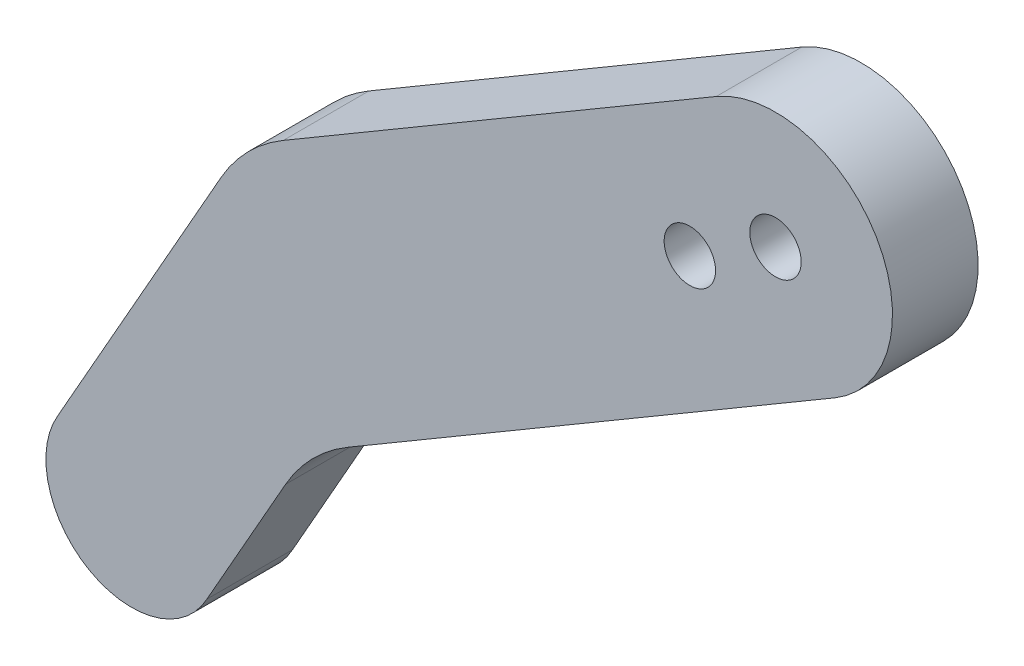
ISO-10303-21;
HEADER;
FILE_DESCRIPTION(('STEP AP214'),'2;1');
FILE_NAME('part.step','',(''),(''),'','','');
FILE_SCHEMA(('AUTOMOTIVE_DESIGN { 1 0 10303 214 1 1 1 1 }'));
ENDSEC;
DATA;
#1=APPLICATION_CONTEXT('core data for automotive mechanical design processes');
#2=APPLICATION_PROTOCOL_DEFINITION('international standard','automotive_design',2000,#1);
#3=PRODUCT_CONTEXT('',#1,'mechanical');
#4=PRODUCT('Part','Part','',(#3));
#5=PRODUCT_RELATED_PRODUCT_CATEGORY('part','',(#4));
#6=PRODUCT_DEFINITION_FORMATION('','',#4);
#7=PRODUCT_DEFINITION_CONTEXT('part definition',#1,'design');
#8=PRODUCT_DEFINITION('design','',#6,#7);
#9=PRODUCT_DEFINITION_SHAPE('','',#8);
#10=(LENGTH_UNIT() NAMED_UNIT(*) SI_UNIT(.MILLI.,.METRE.));
#11=(NAMED_UNIT(*) PLANE_ANGLE_UNIT() SI_UNIT($,.RADIAN.));
#12=(NAMED_UNIT(*) SI_UNIT($,.STERADIAN.) SOLID_ANGLE_UNIT());
#13=UNCERTAINTY_MEASURE_WITH_UNIT(LENGTH_MEASURE(1.E-05),#10,'distance_accuracy_value','');
#14=(GEOMETRIC_REPRESENTATION_CONTEXT(3) GLOBAL_UNCERTAINTY_ASSIGNED_CONTEXT((#13)) GLOBAL_UNIT_ASSIGNED_CONTEXT((#10,
#11,#12)) REPRESENTATION_CONTEXT('',''));
#15=CARTESIAN_POINT('',(0.,0.,0.));
#16=DIRECTION('',(0.,0.,1.));
#17=DIRECTION('',(1.,0.,0.));
#18=AXIS2_PLACEMENT_3D('',#15,#16,#17);
#19=CARTESIAN_POINT('',(8.69918007203384,-4.93196371380908,5.));
#20=DIRECTION('',(-0.869918007203384,0.493196371380907,0.));
#21=DIRECTION('',(-0.493196371380907,-0.869918007203384,0.));
#22=AXIS2_PLACEMENT_3D('',#19,#20,#21);
#23=PLANE('',#22);
#24=DIRECTION('',(0.493196371380907,0.869918007203384,0.));
#25=VECTOR('',#24,1.);
#26=CARTESIAN_POINT('',(8.69918007203384,-4.93196371380908,0.));
#27=LINE('',#26,#25);
#28=CARTESIAN_POINT('',(8.69918007203384,-4.93196371380907,0.));
#29=VERTEX_POINT('',#28);
#30=CARTESIAN_POINT('',(13.29602083439,3.17611409751714,0.));
#31=VERTEX_POINT('',#30);
#32=EDGE_CURVE('E134',#29,#31,#27,.T.);
#33=ORIENTED_EDGE('',*,*,#32,.T.);
#34=DIRECTION('',(0.,0.,-1.));
#35=VECTOR('',#34,1.);
#36=CARTESIAN_POINT('',(13.29602083439,3.17611409751714,5.));
#37=LINE('',#36,#35);
#38=CARTESIAN_POINT('',(13.29602083439,3.17611409751714,5.));
#39=VERTEX_POINT('',#38);
#40=EDGE_CURVE('E11',#39,#31,#37,.T.);
#41=ORIENTED_EDGE('',*,*,#40,.F.);
#42=DIRECTION('',(0.493196371380907,0.869918007203384,0.));
#43=VECTOR('',#42,1.);
#44=CARTESIAN_POINT('',(8.69918007203384,-4.93196371380908,5.));
#45=LINE('',#44,#43);
#46=CARTESIAN_POINT('',(8.69918007203384,-4.93196371380907,5.));
#47=VERTEX_POINT('',#46);
#48=EDGE_CURVE('E153',#47,#39,#45,.T.);
#49=ORIENTED_EDGE('',*,*,#48,.F.);
#50=DIRECTION('',(0.,0.,-1.));
#51=VECTOR('',#50,1.);
#52=CARTESIAN_POINT('',(8.69918007203384,-4.93196371380907,5.));
#53=LINE('',#52,#51);
#54=EDGE_CURVE('E130',#47,#29,#53,.T.);
#55=ORIENTED_EDGE('',*,*,#54,.T.);
#56=EDGE_LOOP('',(#33,#41,#49,#55));
#57=FACE_BOUND('',#56,.T.);
#58=ADVANCED_FACE('F37',(#57),#23,.F.);
#59=CARTESIAN_POINT('',(21.9952009064238,-1.75584961629192,5.));
#60=DIRECTION('',(0.,0.,-1.));
#61=DIRECTION('',(-1.,0.,0.));
#62=AXIS2_PLACEMENT_3D('',#59,#60,#61);
#63=CYLINDRICAL_SURFACE('',#62,10.);
#64=CARTESIAN_POINT('',(21.9952009064238,-1.75584961629192,0.));
#65=DIRECTION('',(0.,0.,1.));
#66=DIRECTION('',(1.,0.,0.));
#67=AXIS2_PLACEMENT_3D('',#64,#65,#66);
#68=CIRCLE('',#67,10.);
#69=CARTESIAN_POINT('',(16.9274718288517,6.8649462864267,0.));
#70=VERTEX_POINT('',#69);
#71=EDGE_CURVE('E137',#31,#70,#68,.F.);
#72=ORIENTED_EDGE('',*,*,#71,.T.);
#73=DIRECTION('',(0.,0.,-1.));
#74=VECTOR('',#73,1.);
#75=CARTESIAN_POINT('',(16.9274718288517,6.8649462864267,5.));
#76=LINE('',#75,#74);
#77=CARTESIAN_POINT('',(16.9274718288517,6.8649462864267,5.));
#78=VERTEX_POINT('',#77);
#79=EDGE_CURVE('E46',#78,#70,#76,.T.);
#80=ORIENTED_EDGE('',*,*,#79,.F.);
#81=CARTESIAN_POINT('',(21.9952009064238,-1.75584961629192,5.));
#82=DIRECTION('',(0.,0.,1.));
#83=DIRECTION('',(1.,0.,0.));
#84=AXIS2_PLACEMENT_3D('',#81,#82,#83);
#85=CIRCLE('',#84,10.);
#86=EDGE_CURVE('E94',#39,#78,#85,.F.);
#87=ORIENTED_EDGE('',*,*,#86,.F.);
#88=ORIENTED_EDGE('',*,*,#40,.T.);
#89=EDGE_LOOP('',(#72,#80,#87,#88));
#90=FACE_BOUND('',#89,.T.);
#91=ADVANCED_FACE('F203',(#90),#63,.F.);
#92=CARTESIAN_POINT('',(1.34814467413126,-2.29335071096395,5.));
#93=DIRECTION('',(-0.50677290775721,0.862079590271862,0.));
#94=DIRECTION('',(-0.862079590271862,-0.50677290775721,0.));
#95=AXIS2_PLACEMENT_3D('',#92,#93,#94);
#96=PLANE('',#95);
#97=DIRECTION('',(0.862079590271862,0.506772907757211,0.));
#98=VECTOR('',#97,1.);
#99=CARTESIAN_POINT('',(1.34814467413126,-2.29335071096395,0.));
#100=LINE('',#99,#98);
#101=CARTESIAN_POINT('',(45.3595137185401,23.5787030027507,0.));
#102=VERTEX_POINT('',#101);
#103=EDGE_CURVE('E140',#70,#102,#100,.T.);
#104=ORIENTED_EDGE('',*,*,#103,.T.);
#105=DIRECTION('',(0.,0.,-1.));
#106=VECTOR('',#105,1.);
#107=CARTESIAN_POINT('',(45.3595137185401,23.5787030027507,5.));
#108=LINE('',#107,#106);
#109=CARTESIAN_POINT('',(45.3595137185401,23.5787030027507,5.));
#110=VERTEX_POINT('',#109);
#111=EDGE_CURVE('E159',#110,#102,#108,.T.);
#112=ORIENTED_EDGE('',*,*,#111,.F.);
#113=DIRECTION('',(0.862079590271862,0.506772907757211,0.));
#114=VECTOR('',#113,1.);
#115=CARTESIAN_POINT('',(1.34814467413126,-2.29335071096395,5.));
#116=LINE('',#115,#114);
#117=EDGE_CURVE('E176',#78,#110,#116,.T.);
#118=ORIENTED_EDGE('',*,*,#117,.F.);
#119=ORIENTED_EDGE('',*,*,#79,.T.);
#120=EDGE_LOOP('',(#104,#112,#118,#119));
#121=FACE_BOUND('',#120,.T.);
#122=ADVANCED_FACE('F207',(#121),#96,.F.);
#123=CARTESIAN_POINT('',(41.8981903888098,29.466816104728,5.));
#124=DIRECTION('',(0.,0.,-1.));
#125=DIRECTION('',(-1.,0.,0.));
#126=AXIS2_PLACEMENT_3D('',#123,#124,#125);
#127=CYLINDRICAL_SURFACE('',#126,6.83012701892219);
#128=CARTESIAN_POINT('',(41.8981903888098,29.466816104728,0.));
#129=DIRECTION('',(0.,0.,1.));
#130=DIRECTION('',(1.,0.,0.));
#131=AXIS2_PLACEMENT_3D('',#128,#129,#130);
#132=CIRCLE('',#131,6.83012701892219);
#133=CARTESIAN_POINT('',(38.4368670590796,35.3549292067052,0.));
#134=VERTEX_POINT('',#133);
#135=EDGE_CURVE('E143',#134,#102,#132,.F.);
#136=ORIENTED_EDGE('',*,*,#135,.F.);
#137=DIRECTION('',(0.,0.,-1.));
#138=VECTOR('',#137,1.);
#139=CARTESIAN_POINT('',(38.4368670590796,35.3549292067052,5.));
#140=LINE('',#139,#138);
#141=CARTESIAN_POINT('',(38.4368670590796,35.3549292067052,5.));
#142=VERTEX_POINT('',#141);
#143=EDGE_CURVE('E157',#142,#134,#140,.T.);
#144=ORIENTED_EDGE('',*,*,#143,.F.);
#145=CARTESIAN_POINT('',(41.8981903888098,29.466816104728,5.));
#146=DIRECTION('',(0.,0.,1.));
#147=DIRECTION('',(1.,0.,0.));
#148=AXIS2_PLACEMENT_3D('',#145,#146,#147);
#149=CIRCLE('',#148,6.83012701892219);
#150=EDGE_CURVE('E178',#142,#110,#149,.F.);
#151=ORIENTED_EDGE('',*,*,#150,.T.);
#152=ORIENTED_EDGE('',*,*,#111,.T.);
#153=EDGE_LOOP('',(#136,#144,#151,#152));
#154=FACE_BOUND('',#153,.T.);
#155=ADVANCED_FACE('F211',(#154),#127,.T.);
#156=CARTESIAN_POINT('',(-5.57450198532932,9.4828754929905,5.));
#157=DIRECTION('',(-0.50677290775721,0.862079590271863,0.));
#158=DIRECTION('',(-0.862079590271862,-0.50677290775721,0.));
#159=AXIS2_PLACEMENT_3D('',#156,#157,#158);
#160=PLANE('',#159);
#161=DIRECTION('',(0.862079590271863,0.50677290775721,0.));
#162=VECTOR('',#161,1.);
#163=CARTESIAN_POINT('',(-5.57450198532932,9.4828754929905,0.));
#164=LINE('',#163,#162);
#165=CARTESIAN_POINT('',(13.1602554706269,20.4960900722696,0.));
#166=VERTEX_POINT('',#165);
#167=EDGE_CURVE('E146',#166,#134,#164,.T.);
#168=ORIENTED_EDGE('',*,*,#167,.F.);
#169=DIRECTION('',(0.,0.,-1.));
#170=VECTOR('',#169,1.);
#171=CARTESIAN_POINT('',(13.1602554706269,20.4960900722696,5.));
#172=LINE('',#171,#170);
#173=CARTESIAN_POINT('',(13.1602554706269,20.4960900722696,5.));
#174=VERTEX_POINT('',#173);
#175=EDGE_CURVE('E119',#174,#166,#172,.T.);
#176=ORIENTED_EDGE('',*,*,#175,.F.);
#177=DIRECTION('',(0.862079590271863,0.50677290775721,0.));
#178=VECTOR('',#177,1.);
#179=CARTESIAN_POINT('',(-5.57450198532932,9.4828754929905,5.));
#180=LINE('',#179,#178);
#181=EDGE_CURVE('E126',#174,#142,#180,.T.);
#182=ORIENTED_EDGE('',*,*,#181,.T.);
#183=ORIENTED_EDGE('',*,*,#143,.T.);
#184=EDGE_LOOP('',(#168,#176,#182,#183));
#185=FACE_BOUND('',#184,.T.);
#186=ADVANCED_FACE('F182',(#185),#160,.T.);
#187=CARTESIAN_POINT('',(18.227984548199,11.875294169551,5.));
#188=DIRECTION('',(0.,0.,-1.));
#189=DIRECTION('',(-1.,0.,0.));
#190=AXIS2_PLACEMENT_3D('',#187,#188,#189);
#191=CYLINDRICAL_SURFACE('',#190,10.);
#192=CARTESIAN_POINT('',(18.227984548199,11.875294169551,0.));
#193=DIRECTION('',(0.,0.,1.));
#194=DIRECTION('',(1.,0.,0.));
#195=AXIS2_PLACEMENT_3D('',#192,#193,#194);
#196=CIRCLE('',#195,10.);
#197=CARTESIAN_POINT('',(9.52880447616521,16.80725788336,0.));
#198=VERTEX_POINT('',#197);
#199=EDGE_CURVE('E114',#198,#166,#196,.F.);
#200=ORIENTED_EDGE('',*,*,#199,.F.);
#201=DIRECTION('',(0.,0.,-1.));
#202=VECTOR('',#201,1.);
#203=CARTESIAN_POINT('',(9.52880447616521,16.80725788336,5.));
#204=LINE('',#203,#202);
#205=CARTESIAN_POINT('',(9.52880447616521,16.80725788336,5.));
#206=VERTEX_POINT('',#205);
#207=EDGE_CURVE('E109',#206,#198,#204,.T.);
#208=ORIENTED_EDGE('',*,*,#207,.F.);
#209=CARTESIAN_POINT('',(18.227984548199,11.875294169551,5.));
#210=DIRECTION('',(0.,0.,1.));
#211=DIRECTION('',(1.,0.,0.));
#212=AXIS2_PLACEMENT_3D('',#209,#210,#211);
#213=CIRCLE('',#212,10.);
#214=EDGE_CURVE('E112',#206,#174,#213,.F.);
#215=ORIENTED_EDGE('',*,*,#214,.T.);
#216=ORIENTED_EDGE('',*,*,#175,.T.);
#217=EDGE_LOOP('',(#200,#208,#215,#216));
#218=FACE_BOUND('',#217,.T.);
#219=ADVANCED_FACE('F111',(#218),#191,.T.);
#220=CARTESIAN_POINT('',(0.,0.,5.));
#221=DIRECTION('',(-0.869918007203384,0.493196371380907,0.));
#222=DIRECTION('',(-0.493196371380907,-0.869918007203384,0.));
#223=AXIS2_PLACEMENT_3D('',#220,#221,#222);
#224=PLANE('',#223);
#225=DIRECTION('',(0.493196371380907,0.869918007203384,0.));
#226=VECTOR('',#225,1.);
#227=CARTESIAN_POINT('',(0.,0.,0.));
#228=LINE('',#227,#226);
#229=CARTESIAN_POINT('',(0.,0.,0.));
#230=VERTEX_POINT('',#229);
#231=EDGE_CURVE('E150',#230,#198,#228,.T.);
#232=ORIENTED_EDGE('',*,*,#231,.F.);
#233=DIRECTION('',(0.,0.,-1.));
#234=VECTOR('',#233,1.);
#235=CARTESIAN_POINT('',(0.,0.,5.));
#236=LINE('',#235,#234);
#237=CARTESIAN_POINT('',(0.,0.,5.));
#238=VERTEX_POINT('',#237);
#239=EDGE_CURVE('E83',#238,#230,#236,.T.);
#240=ORIENTED_EDGE('',*,*,#239,.F.);
#241=DIRECTION('',(0.493196371380907,0.869918007203384,0.));
#242=VECTOR('',#241,1.);
#243=CARTESIAN_POINT('',(0.,0.,5.));
#244=LINE('',#243,#242);
#245=EDGE_CURVE('E123',#238,#206,#244,.T.);
#246=ORIENTED_EDGE('',*,*,#245,.T.);
#247=ORIENTED_EDGE('',*,*,#207,.T.);
#248=EDGE_LOOP('',(#232,#240,#246,#247));
#249=FACE_BOUND('',#248,.T.);
#250=ADVANCED_FACE('F128',(#249),#224,.T.);
#251=CARTESIAN_POINT('',(4.30532765313558,-2.54405348545767,5.));
#252=DIRECTION('',(0.,0.,-1.));
#253=DIRECTION('',(-1.,0.,0.));
#254=AXIS2_PLACEMENT_3D('',#251,#252,#253);
#255=CYLINDRICAL_SURFACE('',#254,5.00080536891042);
#256=CARTESIAN_POINT('',(4.30532765313558,-2.54405348545767,0.));
#257=DIRECTION('',(0.,0.,1.));
#258=DIRECTION('',(1.,0.,0.));
#259=AXIS2_PLACEMENT_3D('',#256,#257,#258);
#260=CIRCLE('',#259,5.00080536891042);
#261=EDGE_CURVE('E86',#230,#29,#260,.T.);
#262=ORIENTED_EDGE('',*,*,#261,.T.);
#263=ORIENTED_EDGE('',*,*,#54,.F.);
#264=CARTESIAN_POINT('',(4.30532765313558,-2.54405348545767,5.));
#265=DIRECTION('',(0.,0.,1.));
#266=DIRECTION('',(1.,0.,0.));
#267=AXIS2_PLACEMENT_3D('',#264,#265,#266);
#268=CIRCLE('',#267,5.00080536891042);
#269=EDGE_CURVE('E55',#238,#47,#268,.T.);
#270=ORIENTED_EDGE('',*,*,#269,.F.);
#271=ORIENTED_EDGE('',*,*,#239,.T.);
#272=EDGE_LOOP('',(#262,#263,#270,#271));
#273=FACE_BOUND('',#272,.T.);
#274=ADVANCED_FACE('F191',(#273),#255,.T.);
#275=CARTESIAN_POINT('',(0.,0.,5.));
#276=DIRECTION('',(0.,0.,1.));
#277=DIRECTION('',(1.,0.,0.));
#278=AXIS2_PLACEMENT_3D('',#275,#276,#277);
#279=PLANE('',#278);
#280=CARTESIAN_POINT('',(36.8981903888099,26.5275694651144,5.));
#281=DIRECTION('',(0.,0.,1.));
#282=DIRECTION('',(1.,0.,0.));
#283=AXIS2_PLACEMENT_3D('',#280,#281,#282);
#284=CIRCLE('',#283,1.5);
#285=CARTESIAN_POINT('',(38.3981903888099,26.5275694651144,5.));
#286=VERTEX_POINT('',#285);
#287=EDGE_CURVE('E171',#286,#286,#284,.T.);
#288=ORIENTED_EDGE('',*,*,#287,.F.);
#289=EDGE_LOOP('',(#288));
#290=FACE_BOUND('',#289,.T.);
#291=CARTESIAN_POINT('',(41.8981903888098,29.466816104728,5.));
#292=DIRECTION('',(0.,0.,1.));
#293=DIRECTION('',(1.,0.,0.));
#294=AXIS2_PLACEMENT_3D('',#291,#292,#293);
#295=CIRCLE('',#294,1.5);
#296=CARTESIAN_POINT('',(43.3981903888099,29.466816104728,5.));
#297=VERTEX_POINT('',#296);
#298=EDGE_CURVE('E163',#297,#297,#295,.T.);
#299=ORIENTED_EDGE('',*,*,#298,.F.);
#300=EDGE_LOOP('',(#299));
#301=FACE_BOUND('',#300,.T.);
#302=ORIENTED_EDGE('',*,*,#48,.T.);
#303=ORIENTED_EDGE('',*,*,#86,.T.);
#304=ORIENTED_EDGE('',*,*,#117,.T.);
#305=ORIENTED_EDGE('',*,*,#150,.F.);
#306=ORIENTED_EDGE('',*,*,#181,.F.);
#307=ORIENTED_EDGE('',*,*,#214,.F.);
#308=ORIENTED_EDGE('',*,*,#245,.F.);
#309=ORIENTED_EDGE('',*,*,#269,.T.);
#310=EDGE_LOOP('',(#302,#303,#304,#305,#306,#307,#308,#309));
#311=FACE_BOUND('',#310,.T.);
#312=ADVANCED_FACE('F122',(#290,#301,#311),#279,.T.);
#313=CARTESIAN_POINT('',(0.,0.,0.));
#314=DIRECTION('',(0.,0.,1.));
#315=DIRECTION('',(1.,0.,0.));
#316=AXIS2_PLACEMENT_3D('',#313,#314,#315);
#317=PLANE('',#316);
#318=CARTESIAN_POINT('',(36.8981903888099,26.5275694651144,0.));
#319=DIRECTION('',(0.,0.,1.));
#320=DIRECTION('',(1.,0.,0.));
#321=AXIS2_PLACEMENT_3D('',#318,#319,#320);
#322=CIRCLE('',#321,1.5);
#323=CARTESIAN_POINT('',(38.3981903888099,26.5275694651144,0.));
#324=VERTEX_POINT('',#323);
#325=EDGE_CURVE('E40',#324,#324,#322,.T.);
#326=ORIENTED_EDGE('',*,*,#325,.T.);
#327=EDGE_LOOP('',(#326));
#328=FACE_BOUND('',#327,.T.);
#329=CARTESIAN_POINT('',(41.8981903888098,29.466816104728,0.));
#330=DIRECTION('',(0.,0.,1.));
#331=DIRECTION('',(1.,0.,0.));
#332=AXIS2_PLACEMENT_3D('',#329,#330,#331);
#333=CIRCLE('',#332,1.5);
#334=CARTESIAN_POINT('',(43.3981903888099,29.466816104728,0.));
#335=VERTEX_POINT('',#334);
#336=EDGE_CURVE('E138',#335,#335,#333,.T.);
#337=ORIENTED_EDGE('',*,*,#336,.T.);
#338=EDGE_LOOP('',(#337));
#339=FACE_BOUND('',#338,.T.);
#340=ORIENTED_EDGE('',*,*,#32,.F.);
#341=ORIENTED_EDGE('',*,*,#261,.F.);
#342=ORIENTED_EDGE('',*,*,#231,.T.);
#343=ORIENTED_EDGE('',*,*,#199,.T.);
#344=ORIENTED_EDGE('',*,*,#167,.T.);
#345=ORIENTED_EDGE('',*,*,#135,.T.);
#346=ORIENTED_EDGE('',*,*,#103,.F.);
#347=ORIENTED_EDGE('',*,*,#71,.F.);
#348=EDGE_LOOP('',(#340,#341,#342,#343,#344,#345,#346,#347));
#349=FACE_BOUND('',#348,.T.);
#350=ADVANCED_FACE('F186',(#328,#339,#349),#317,.F.);
#351=CARTESIAN_POINT('',(41.8981903888098,29.466816104728,-2.));
#352=DIRECTION('',(0.,0.,1.));
#353=DIRECTION('',(1.,0.,0.));
#354=AXIS2_PLACEMENT_3D('',#351,#352,#353);
#355=CYLINDRICAL_SURFACE('',#354,1.5);
#356=ORIENTED_EDGE('',*,*,#298,.T.);
#357=EDGE_LOOP('',(#356));
#358=FACE_BOUND('',#357,.T.);
#359=ORIENTED_EDGE('',*,*,#336,.F.);
#360=EDGE_LOOP('',(#359));
#361=FACE_BOUND('',#360,.T.);
#362=ADVANCED_FACE('F248',(#358,#361),#355,.F.);
#363=CARTESIAN_POINT('',(36.8981903888099,26.5275694651144,-2.));
#364=DIRECTION('',(0.,0.,1.));
#365=DIRECTION('',(1.,0.,0.));
#366=AXIS2_PLACEMENT_3D('',#363,#364,#365);
#367=CYLINDRICAL_SURFACE('',#366,1.5);
#368=ORIENTED_EDGE('',*,*,#287,.T.);
#369=EDGE_LOOP('',(#368));
#370=FACE_BOUND('',#369,.T.);
#371=ORIENTED_EDGE('',*,*,#325,.F.);
#372=EDGE_LOOP('',(#371));
#373=FACE_BOUND('',#372,.T.);
#374=ADVANCED_FACE('F257',(#370,#373),#367,.F.);
#375=CLOSED_SHELL('',(#58,#91,#122,#155,#186,#219,#250,#274,#312,#350,#362,#374));
#376=MANIFOLD_SOLID_BREP('B2',#375);
#377=ADVANCED_BREP_SHAPE_REPRESENTATION('',(#18,#376),#14);
#378=SHAPE_DEFINITION_REPRESENTATION(#9,#377);
ENDSEC;
END-ISO-10303-21;
